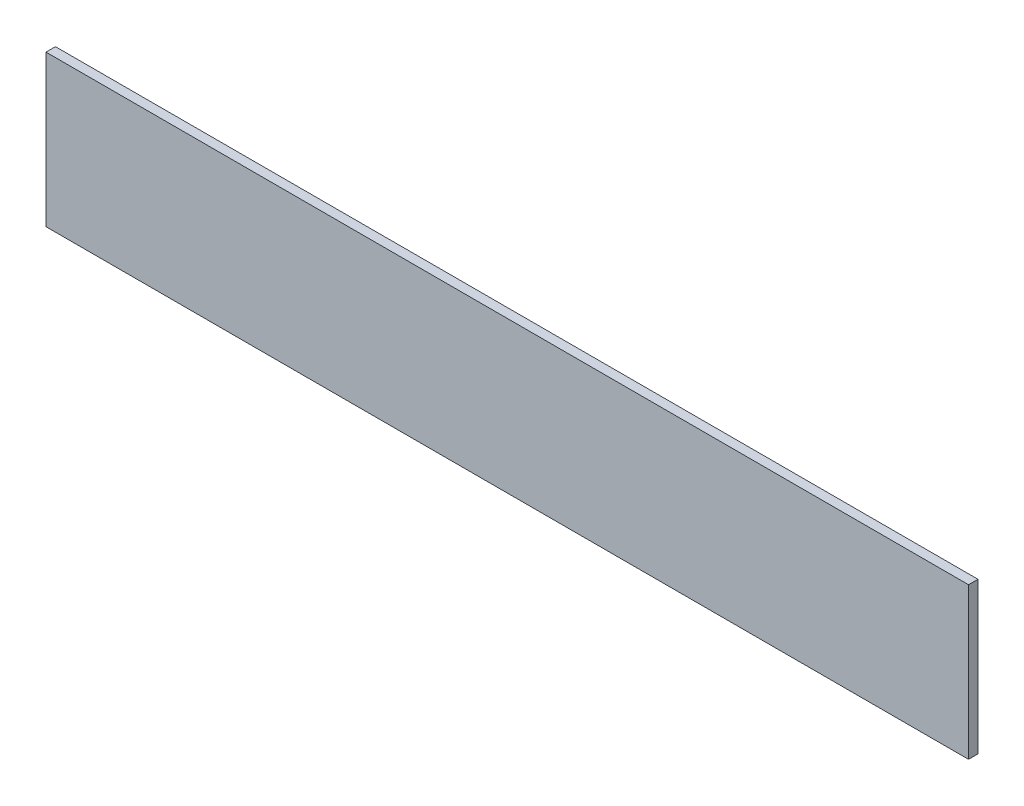
ISO-10303-21;
HEADER;
FILE_DESCRIPTION(('STEP AP214'),'2;1');
FILE_NAME('part.step','',(''),(''),'','','');
FILE_SCHEMA(('AUTOMOTIVE_DESIGN { 1 0 10303 214 1 1 1 1 }'));
ENDSEC;
DATA;
#1=APPLICATION_CONTEXT('core data for automotive mechanical design processes');
#2=APPLICATION_PROTOCOL_DEFINITION('international standard','automotive_design',2000,#1);
#3=PRODUCT_CONTEXT('',#1,'mechanical');
#4=PRODUCT('Part','Part','',(#3));
#5=PRODUCT_RELATED_PRODUCT_CATEGORY('part','',(#4));
#6=PRODUCT_DEFINITION_FORMATION('','',#4);
#7=PRODUCT_DEFINITION_CONTEXT('part definition',#1,'design');
#8=PRODUCT_DEFINITION('design','',#6,#7);
#9=PRODUCT_DEFINITION_SHAPE('','',#8);
#10=(LENGTH_UNIT() NAMED_UNIT(*) SI_UNIT(.MILLI.,.METRE.));
#11=(NAMED_UNIT(*) PLANE_ANGLE_UNIT() SI_UNIT($,.RADIAN.));
#12=(NAMED_UNIT(*) SI_UNIT($,.STERADIAN.) SOLID_ANGLE_UNIT());
#13=UNCERTAINTY_MEASURE_WITH_UNIT(LENGTH_MEASURE(1.E-05),#10,'distance_accuracy_value','');
#14=(GEOMETRIC_REPRESENTATION_CONTEXT(3) GLOBAL_UNCERTAINTY_ASSIGNED_CONTEXT((#13)) GLOBAL_UNIT_ASSIGNED_CONTEXT((#10,
#11,#12)) REPRESENTATION_CONTEXT('',''));
#15=CARTESIAN_POINT('',(0.,0.,0.));
#16=DIRECTION('',(0.,0.,1.));
#17=DIRECTION('',(1.,0.,0.));
#18=AXIS2_PLACEMENT_3D('',#15,#16,#17);
#19=CARTESIAN_POINT('',(0.,0.,6.35));
#20=DIRECTION('',(1.,0.,0.));
#21=DIRECTION('',(0.,0.,-1.));
#22=AXIS2_PLACEMENT_3D('',#19,#20,#21);
#23=PLANE('',#22);
#24=DIRECTION('',(0.,-1.,0.));
#25=VECTOR('',#24,1.);
#26=CARTESIAN_POINT('',(0.,0.,0.));
#27=LINE('',#26,#25);
#28=CARTESIAN_POINT('',(0.,101.6,0.));
#29=VERTEX_POINT('',#28);
#30=CARTESIAN_POINT('',(0.,0.,0.));
#31=VERTEX_POINT('',#30);
#32=EDGE_CURVE('E96',#29,#31,#27,.T.);
#33=ORIENTED_EDGE('',*,*,#32,.T.);
#34=DIRECTION('',(0.,0.,-1.));
#35=VECTOR('',#34,1.);
#36=CARTESIAN_POINT('',(0.,0.,6.35));
#37=LINE('',#36,#35);
#38=CARTESIAN_POINT('',(0.,0.,6.35));
#39=VERTEX_POINT('',#38);
#40=EDGE_CURVE('E11',#39,#31,#37,.T.);
#41=ORIENTED_EDGE('',*,*,#40,.F.);
#42=DIRECTION('',(0.,-1.,0.));
#43=VECTOR('',#42,1.);
#44=CARTESIAN_POINT('',(0.,0.,6.35));
#45=LINE('',#44,#43);
#46=CARTESIAN_POINT('',(0.,101.6,6.35));
#47=VERTEX_POINT('',#46);
#48=EDGE_CURVE('E84',#47,#39,#45,.T.);
#49=ORIENTED_EDGE('',*,*,#48,.F.);
#50=DIRECTION('',(0.,0.,-1.));
#51=VECTOR('',#50,1.);
#52=CARTESIAN_POINT('',(0.,101.6,6.35));
#53=LINE('',#52,#51);
#54=EDGE_CURVE('E92',#47,#29,#53,.T.);
#55=ORIENTED_EDGE('',*,*,#54,.T.);
#56=EDGE_LOOP('',(#33,#41,#49,#55));
#57=FACE_BOUND('',#56,.T.);
#58=ADVANCED_FACE('F33',(#57),#23,.F.);
#59=CARTESIAN_POINT('',(0.,0.,6.35));
#60=DIRECTION('',(0.,1.,0.));
#61=DIRECTION('',(0.,0.,1.));
#62=AXIS2_PLACEMENT_3D('',#59,#60,#61);
#63=PLANE('',#62);
#64=DIRECTION('',(1.,0.,0.));
#65=VECTOR('',#64,1.);
#66=CARTESIAN_POINT('',(0.,0.,0.));
#67=LINE('',#66,#65);
#68=CARTESIAN_POINT('',(619.76,0.,0.));
#69=VERTEX_POINT('',#68);
#70=EDGE_CURVE('E88',#31,#69,#67,.T.);
#71=ORIENTED_EDGE('',*,*,#70,.T.);
#72=DIRECTION('',(0.,0.,-1.));
#73=VECTOR('',#72,1.);
#74=CARTESIAN_POINT('',(619.76,0.,6.35));
#75=LINE('',#74,#73);
#76=CARTESIAN_POINT('',(619.76,0.,6.35));
#77=VERTEX_POINT('',#76);
#78=EDGE_CURVE('E41',#77,#69,#75,.T.);
#79=ORIENTED_EDGE('',*,*,#78,.F.);
#80=DIRECTION('',(1.,0.,0.));
#81=VECTOR('',#80,1.);
#82=CARTESIAN_POINT('',(0.,0.,6.35));
#83=LINE('',#82,#81);
#84=EDGE_CURVE('E79',#39,#77,#83,.T.);
#85=ORIENTED_EDGE('',*,*,#84,.F.);
#86=ORIENTED_EDGE('',*,*,#40,.T.);
#87=EDGE_LOOP('',(#71,#79,#85,#86));
#88=FACE_BOUND('',#87,.T.);
#89=ADVANCED_FACE('F87',(#88),#63,.F.);
#90=CARTESIAN_POINT('',(619.76,0.,6.35));
#91=DIRECTION('',(-1.,0.,0.));
#92=DIRECTION('',(0.,0.,1.));
#93=AXIS2_PLACEMENT_3D('',#90,#91,#92);
#94=PLANE('',#93);
#95=DIRECTION('',(0.,1.,0.));
#96=VECTOR('',#95,1.);
#97=CARTESIAN_POINT('',(619.76,0.,0.));
#98=LINE('',#97,#96);
#99=CARTESIAN_POINT('',(619.76,101.6,0.));
#100=VERTEX_POINT('',#99);
#101=EDGE_CURVE('E66',#69,#100,#98,.T.);
#102=ORIENTED_EDGE('',*,*,#101,.T.);
#103=DIRECTION('',(0.,0.,-1.));
#104=VECTOR('',#103,1.);
#105=CARTESIAN_POINT('',(619.76,101.6,6.35));
#106=LINE('',#105,#104);
#107=CARTESIAN_POINT('',(619.76,101.6,6.35));
#108=VERTEX_POINT('',#107);
#109=EDGE_CURVE('E89',#108,#100,#106,.T.);
#110=ORIENTED_EDGE('',*,*,#109,.F.);
#111=DIRECTION('',(0.,1.,0.));
#112=VECTOR('',#111,1.);
#113=CARTESIAN_POINT('',(619.76,0.,6.35));
#114=LINE('',#113,#112);
#115=EDGE_CURVE('E82',#77,#108,#114,.T.);
#116=ORIENTED_EDGE('',*,*,#115,.F.);
#117=ORIENTED_EDGE('',*,*,#78,.T.);
#118=EDGE_LOOP('',(#102,#110,#116,#117));
#119=FACE_BOUND('',#118,.T.);
#120=ADVANCED_FACE('F90',(#119),#94,.F.);
#121=CARTESIAN_POINT('',(0.,101.6,6.35));
#122=DIRECTION('',(0.,-1.,0.));
#123=DIRECTION('',(0.,0.,-1.));
#124=AXIS2_PLACEMENT_3D('',#121,#122,#123);
#125=PLANE('',#124);
#126=DIRECTION('',(-1.,0.,0.));
#127=VECTOR('',#126,1.);
#128=CARTESIAN_POINT('',(0.,101.6,0.));
#129=LINE('',#128,#127);
#130=EDGE_CURVE('E72',#100,#29,#129,.T.);
#131=ORIENTED_EDGE('',*,*,#130,.T.);
#132=ORIENTED_EDGE('',*,*,#54,.F.);
#133=DIRECTION('',(-1.,0.,0.));
#134=VECTOR('',#133,1.);
#135=CARTESIAN_POINT('',(0.,101.6,6.35));
#136=LINE('',#135,#134);
#137=EDGE_CURVE('E49',#108,#47,#136,.T.);
#138=ORIENTED_EDGE('',*,*,#137,.F.);
#139=ORIENTED_EDGE('',*,*,#109,.T.);
#140=EDGE_LOOP('',(#131,#132,#138,#139));
#141=FACE_BOUND('',#140,.T.);
#142=ADVANCED_FACE('F103',(#141),#125,.F.);
#143=CARTESIAN_POINT('',(0.,0.,6.35));
#144=DIRECTION('',(0.,0.,-1.));
#145=DIRECTION('',(-1.,0.,0.));
#146=AXIS2_PLACEMENT_3D('',#143,#144,#145);
#147=PLANE('',#146);
#148=ORIENTED_EDGE('',*,*,#48,.T.);
#149=ORIENTED_EDGE('',*,*,#84,.T.);
#150=ORIENTED_EDGE('',*,*,#115,.T.);
#151=ORIENTED_EDGE('',*,*,#137,.T.);
#152=EDGE_LOOP('',(#148,#149,#150,#151));
#153=FACE_BOUND('',#152,.T.);
#154=ADVANCED_FACE('F80',(#153),#147,.F.);
#155=CARTESIAN_POINT('',(0.,0.,0.));
#156=DIRECTION('',(0.,0.,-1.));
#157=DIRECTION('',(-1.,0.,0.));
#158=AXIS2_PLACEMENT_3D('',#155,#156,#157);
#159=PLANE('',#158);
#160=ORIENTED_EDGE('',*,*,#32,.F.);
#161=ORIENTED_EDGE('',*,*,#130,.F.);
#162=ORIENTED_EDGE('',*,*,#101,.F.);
#163=ORIENTED_EDGE('',*,*,#70,.F.);
#164=EDGE_LOOP('',(#160,#161,#162,#163));
#165=FACE_BOUND('',#164,.T.);
#166=ADVANCED_FACE('F106',(#165),#159,.T.);
#167=CLOSED_SHELL('',(#58,#89,#120,#142,#154,#166));
#168=MANIFOLD_SOLID_BREP('B2',#167);
#169=ADVANCED_BREP_SHAPE_REPRESENTATION('',(#18,#168),#14);
#170=SHAPE_DEFINITION_REPRESENTATION(#9,#169);
ENDSEC;
END-ISO-10303-21;
